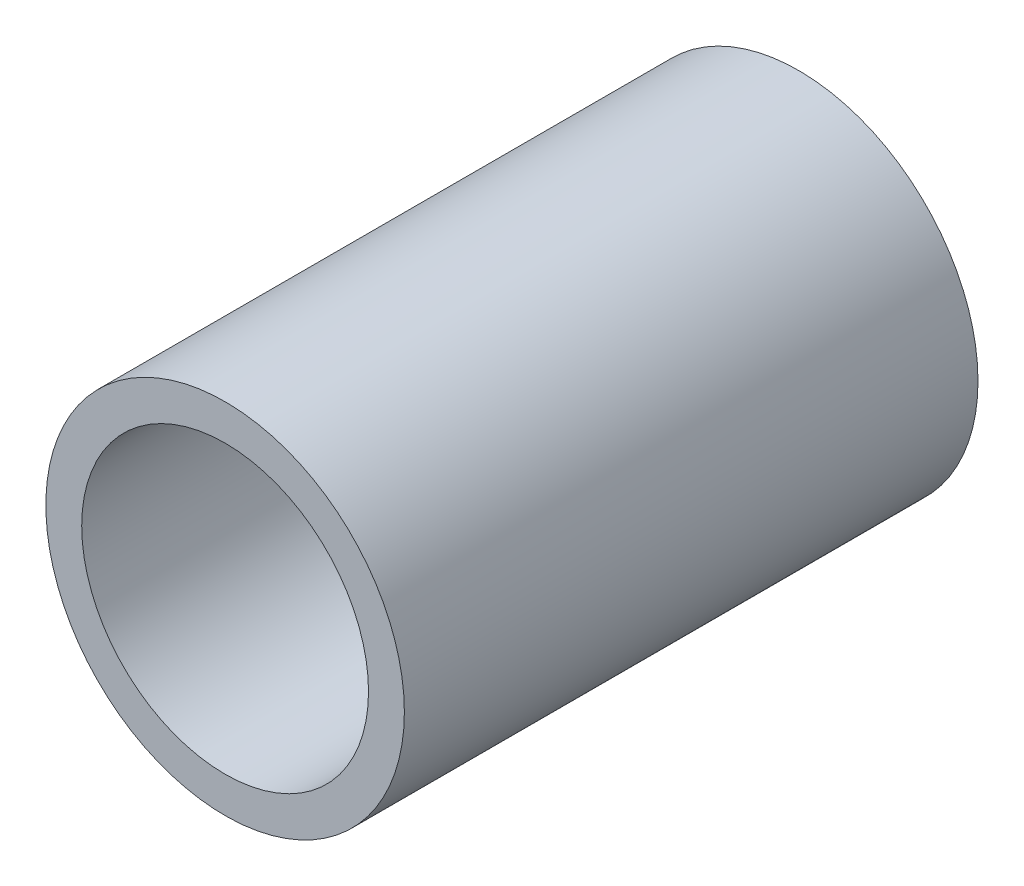
ISO-10303-21;
HEADER;
FILE_DESCRIPTION(('STEP AP214'),'2;1');
FILE_NAME('part.step','',(''),(''),'','','');
FILE_SCHEMA(('AUTOMOTIVE_DESIGN { 1 0 10303 214 1 1 1 1 }'));
ENDSEC;
DATA;
#1=APPLICATION_CONTEXT('core data for automotive mechanical design processes');
#2=APPLICATION_PROTOCOL_DEFINITION('international standard','automotive_design',2000,#1);
#3=PRODUCT_CONTEXT('',#1,'mechanical');
#4=PRODUCT('Part','Part','',(#3));
#5=PRODUCT_RELATED_PRODUCT_CATEGORY('part','',(#4));
#6=PRODUCT_DEFINITION_FORMATION('','',#4);
#7=PRODUCT_DEFINITION_CONTEXT('part definition',#1,'design');
#8=PRODUCT_DEFINITION('design','',#6,#7);
#9=PRODUCT_DEFINITION_SHAPE('','',#8);
#10=(LENGTH_UNIT() NAMED_UNIT(*) SI_UNIT(.MILLI.,.METRE.));
#11=(NAMED_UNIT(*) PLANE_ANGLE_UNIT() SI_UNIT($,.RADIAN.));
#12=(NAMED_UNIT(*) SI_UNIT($,.STERADIAN.) SOLID_ANGLE_UNIT());
#13=UNCERTAINTY_MEASURE_WITH_UNIT(LENGTH_MEASURE(1.E-05),#10,'distance_accuracy_value','');
#14=(GEOMETRIC_REPRESENTATION_CONTEXT(3) GLOBAL_UNCERTAINTY_ASSIGNED_CONTEXT((#13)) GLOBAL_UNIT_ASSIGNED_CONTEXT((#10,
#11,#12)) REPRESENTATION_CONTEXT('',''));
#15=CARTESIAN_POINT('',(0.,0.,0.));
#16=DIRECTION('',(0.,0.,1.));
#17=DIRECTION('',(1.,0.,0.));
#18=AXIS2_PLACEMENT_3D('',#15,#16,#17);
#19=CARTESIAN_POINT('',(0.,0.,25.4));
#20=DIRECTION('',(0.,0.,1.));
#21=DIRECTION('',(1.,0.,0.));
#22=AXIS2_PLACEMENT_3D('',#19,#20,#21);
#23=PLANE('',#22);
#24=CARTESIAN_POINT('',(0.,0.,25.4));
#25=DIRECTION('',(0.,0.,1.));
#26=DIRECTION('',(1.,0.,0.));
#27=AXIS2_PLACEMENT_3D('',#24,#25,#26);
#28=CIRCLE('',#27,7.9375);
#29=CARTESIAN_POINT('',(7.9375,0.,25.4));
#30=VERTEX_POINT('',#29);
#31=EDGE_CURVE('E10',#30,#30,#28,.T.);
#32=ORIENTED_EDGE('',*,*,#31,.T.);
#33=EDGE_LOOP('',(#32));
#34=FACE_BOUND('',#33,.T.);
#35=CARTESIAN_POINT('',(0.,0.,25.4));
#36=DIRECTION('',(0.,0.,1.));
#37=DIRECTION('',(1.,0.,0.));
#38=AXIS2_PLACEMENT_3D('',#35,#36,#37);
#39=CIRCLE('',#38,6.35);
#40=CARTESIAN_POINT('',(6.35,0.,25.4));
#41=VERTEX_POINT('',#40);
#42=EDGE_CURVE('E44',#41,#41,#39,.T.);
#43=ORIENTED_EDGE('',*,*,#42,.F.);
#44=EDGE_LOOP('',(#43));
#45=FACE_BOUND('',#44,.T.);
#46=ADVANCED_FACE('F33',(#34,#45),#23,.T.);
#47=CARTESIAN_POINT('',(0.,0.,0.));
#48=DIRECTION('',(0.,0.,1.));
#49=DIRECTION('',(1.,0.,0.));
#50=AXIS2_PLACEMENT_3D('',#47,#48,#49);
#51=PLANE('',#50);
#52=CARTESIAN_POINT('',(0.,0.,0.));
#53=DIRECTION('',(0.,0.,1.));
#54=DIRECTION('',(1.,0.,0.));
#55=AXIS2_PLACEMENT_3D('',#52,#53,#54);
#56=CIRCLE('',#55,7.9375);
#57=CARTESIAN_POINT('',(7.9375,0.,0.));
#58=VERTEX_POINT('',#57);
#59=EDGE_CURVE('E37',#58,#58,#56,.T.);
#60=ORIENTED_EDGE('',*,*,#59,.F.);
#61=EDGE_LOOP('',(#60));
#62=FACE_BOUND('',#61,.T.);
#63=CARTESIAN_POINT('',(0.,0.,0.));
#64=DIRECTION('',(0.,0.,1.));
#65=DIRECTION('',(1.,0.,0.));
#66=AXIS2_PLACEMENT_3D('',#63,#64,#65);
#67=CIRCLE('',#66,6.35);
#68=CARTESIAN_POINT('',(6.35,0.,0.));
#69=VERTEX_POINT('',#68);
#70=EDGE_CURVE('E46',#69,#69,#67,.T.);
#71=ORIENTED_EDGE('',*,*,#70,.T.);
#72=EDGE_LOOP('',(#71));
#73=FACE_BOUND('',#72,.T.);
#74=ADVANCED_FACE('F56',(#62,#73),#51,.F.);
#75=CARTESIAN_POINT('',(0.,0.,25.4));
#76=DIRECTION('',(0.,0.,-1.));
#77=DIRECTION('',(-1.,0.,0.));
#78=AXIS2_PLACEMENT_3D('',#75,#76,#77);
#79=CYLINDRICAL_SURFACE('',#78,7.9375);
#80=ORIENTED_EDGE('',*,*,#31,.F.);
#81=EDGE_LOOP('',(#80));
#82=FACE_BOUND('',#81,.T.);
#83=ORIENTED_EDGE('',*,*,#59,.T.);
#84=EDGE_LOOP('',(#83));
#85=FACE_BOUND('',#84,.T.);
#86=ADVANCED_FACE('F35',(#82,#85),#79,.T.);
#87=CARTESIAN_POINT('',(0.,0.,25.4));
#88=DIRECTION('',(0.,0.,-1.));
#89=DIRECTION('',(-1.,0.,0.));
#90=AXIS2_PLACEMENT_3D('',#87,#88,#89);
#91=CYLINDRICAL_SURFACE('',#90,6.35);
#92=ORIENTED_EDGE('',*,*,#42,.T.);
#93=EDGE_LOOP('',(#92));
#94=FACE_BOUND('',#93,.T.);
#95=ORIENTED_EDGE('',*,*,#70,.F.);
#96=EDGE_LOOP('',(#95));
#97=FACE_BOUND('',#96,.T.);
#98=ADVANCED_FACE('F52',(#94,#97),#91,.F.);
#99=CLOSED_SHELL('',(#46,#74,#86,#98));
#100=MANIFOLD_SOLID_BREP('B2',#99);
#101=ADVANCED_BREP_SHAPE_REPRESENTATION('',(#18,#100),#14);
#102=SHAPE_DEFINITION_REPRESENTATION(#9,#101);
ENDSEC;
END-ISO-10303-21;
